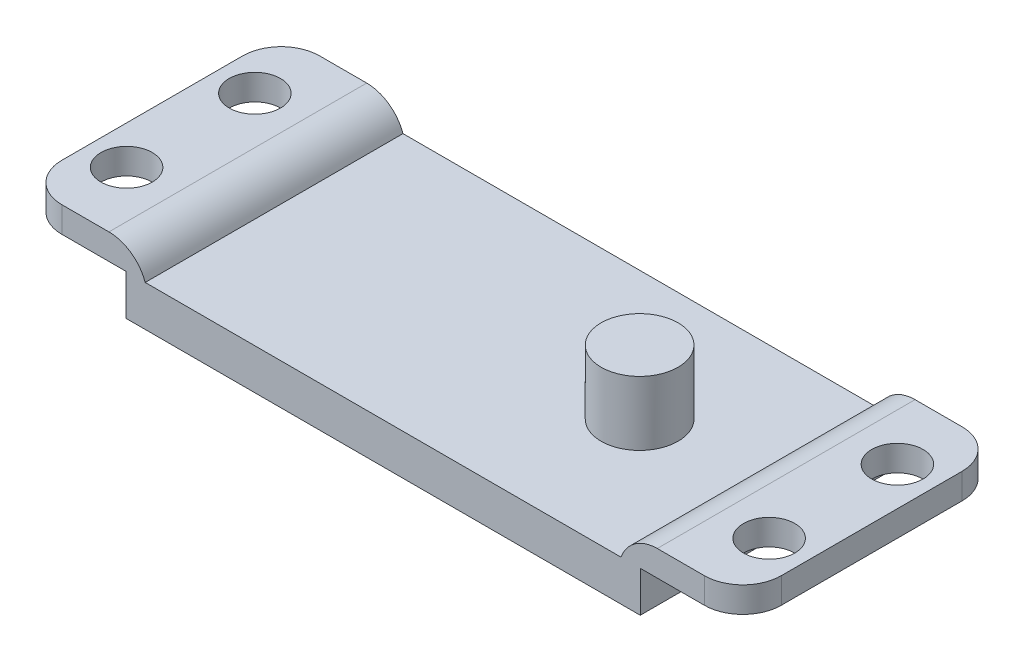
ISO-10303-21;
HEADER;
FILE_DESCRIPTION(('STEP AP214'),'2;1');
FILE_NAME('part.step','',(''),(''),'','','');
FILE_SCHEMA(('AUTOMOTIVE_DESIGN { 1 0 10303 214 1 1 1 1 }'));
ENDSEC;
DATA;
#1=APPLICATION_CONTEXT('core data for automotive mechanical design processes');
#2=APPLICATION_PROTOCOL_DEFINITION('international standard','automotive_design',2000,#1);
#3=PRODUCT_CONTEXT('',#1,'mechanical');
#4=PRODUCT('Part','Part','',(#3));
#5=PRODUCT_RELATED_PRODUCT_CATEGORY('part','',(#4));
#6=PRODUCT_DEFINITION_FORMATION('','',#4);
#7=PRODUCT_DEFINITION_CONTEXT('part definition',#1,'design');
#8=PRODUCT_DEFINITION('design','',#6,#7);
#9=PRODUCT_DEFINITION_SHAPE('','',#8);
#10=(LENGTH_UNIT() NAMED_UNIT(*) SI_UNIT(.MILLI.,.METRE.));
#11=(NAMED_UNIT(*) PLANE_ANGLE_UNIT() SI_UNIT($,.RADIAN.));
#12=(NAMED_UNIT(*) SI_UNIT($,.STERADIAN.) SOLID_ANGLE_UNIT());
#13=UNCERTAINTY_MEASURE_WITH_UNIT(LENGTH_MEASURE(1.E-05),#10,'distance_accuracy_value','');
#14=(GEOMETRIC_REPRESENTATION_CONTEXT(3) GLOBAL_UNCERTAINTY_ASSIGNED_CONTEXT((#13)) GLOBAL_UNIT_ASSIGNED_CONTEXT((#10,
#11,#12)) REPRESENTATION_CONTEXT('',''));
#15=CARTESIAN_POINT('',(0.,0.,0.));
#16=DIRECTION('',(0.,0.,1.));
#17=DIRECTION('',(1.,0.,0.));
#18=AXIS2_PLACEMENT_3D('',#15,#16,#17);
#19=CARTESIAN_POINT('',(20.05,3.175,10.05));
#20=DIRECTION('',(-1.,0.,0.));
#21=DIRECTION('',(0.,0.,1.));
#22=AXIS2_PLACEMENT_3D('',#19,#20,#21);
#23=PLANE('',#22);
#24=DIRECTION('',(0.,0.,-1.));
#25=VECTOR('',#24,1.);
#26=CARTESIAN_POINT('',(20.05,3.175,10.05));
#27=LINE('',#26,#25);
#28=CARTESIAN_POINT('',(20.05,3.175,10.05));
#29=VERTEX_POINT('',#28);
#30=CARTESIAN_POINT('',(20.05,3.175,-10.05));
#31=VERTEX_POINT('',#30);
#32=EDGE_CURVE('E191',#29,#31,#27,.T.);
#33=ORIENTED_EDGE('',*,*,#32,.F.);
#34=DIRECTION('',(0.,-1.,0.));
#35=VECTOR('',#34,1.);
#36=CARTESIAN_POINT('',(20.05,3.175,10.05));
#37=LINE('',#36,#35);
#38=CARTESIAN_POINT('',(20.05,0.,10.05));
#39=VERTEX_POINT('',#38);
#40=EDGE_CURVE('E174',#29,#39,#37,.T.);
#41=ORIENTED_EDGE('',*,*,#40,.T.);
#42=DIRECTION('',(0.,0.,-1.));
#43=VECTOR('',#42,1.);
#44=CARTESIAN_POINT('',(20.05,0.,10.05));
#45=LINE('',#44,#43);
#46=CARTESIAN_POINT('',(20.05,0.,-10.05));
#47=VERTEX_POINT('',#46);
#48=EDGE_CURVE('E293',#39,#47,#45,.T.);
#49=ORIENTED_EDGE('',*,*,#48,.T.);
#50=DIRECTION('',(0.,-1.,0.));
#51=VECTOR('',#50,1.);
#52=CARTESIAN_POINT('',(20.05,3.175,-10.05));
#53=LINE('',#52,#51);
#54=EDGE_CURVE('E176',#31,#47,#53,.T.);
#55=ORIENTED_EDGE('',*,*,#54,.F.);
#56=EDGE_LOOP('',(#33,#41,#49,#55));
#57=FACE_BOUND('',#56,.T.);
#58=ADVANCED_FACE('F33',(#57),#23,.F.);
#59=CARTESIAN_POINT('',(0.,3.175,0.));
#60=DIRECTION('',(0.,-1.,0.));
#61=DIRECTION('',(0.,0.,-1.));
#62=AXIS2_PLACEMENT_3D('',#59,#60,#61);
#63=PLANE('',#62);
#64=CARTESIAN_POINT('',(9.95,3.175,0.));
#65=DIRECTION('',(0.,-1.,0.));
#66=DIRECTION('',(0.,0.,-1.));
#67=AXIS2_PLACEMENT_3D('',#64,#65,#66);
#68=CIRCLE('',#67,3.);
#69=CARTESIAN_POINT('',(9.95,3.175,-3.));
#70=VERTEX_POINT('',#69);
#71=EDGE_CURVE('E11',#70,#70,#68,.F.);
#72=ORIENTED_EDGE('',*,*,#71,.F.);
#73=EDGE_LOOP('',(#72));
#74=FACE_BOUND('',#73,.T.);
#75=DIRECTION('',(-1.,0.,0.));
#76=VECTOR('',#75,1.);
#77=CARTESIAN_POINT('',(-20.05,3.175,-10.05));
#78=LINE('',#77,#76);
#79=CARTESIAN_POINT('',(18.55,3.175,-10.05));
#80=VERTEX_POINT('',#79);
#81=CARTESIAN_POINT('',(-18.55,3.175,-10.05));
#82=VERTEX_POINT('',#81);
#83=EDGE_CURVE('E296',#80,#82,#78,.T.);
#84=ORIENTED_EDGE('',*,*,#83,.T.);
#85=DIRECTION('',(0.,0.,1.));
#86=VECTOR('',#85,1.);
#87=CARTESIAN_POINT('',(-18.55,3.175,-10.05));
#88=LINE('',#87,#86);
#89=CARTESIAN_POINT('',(-18.55,3.175,10.05));
#90=VERTEX_POINT('',#89);
#91=EDGE_CURVE('E250',#82,#90,#88,.T.);
#92=ORIENTED_EDGE('',*,*,#91,.T.);
#93=DIRECTION('',(1.,0.,0.));
#94=VECTOR('',#93,1.);
#95=CARTESIAN_POINT('',(-20.05,3.175,10.05));
#96=LINE('',#95,#94);
#97=CARTESIAN_POINT('',(18.55,3.175,10.05));
#98=VERTEX_POINT('',#97);
#99=EDGE_CURVE('E178',#90,#98,#96,.T.);
#100=ORIENTED_EDGE('',*,*,#99,.T.);
#101=DIRECTION('',(0.,0.,1.));
#102=VECTOR('',#101,1.);
#103=CARTESIAN_POINT('',(18.55,3.175,-10.05));
#104=LINE('',#103,#102);
#105=EDGE_CURVE('E287',#80,#98,#104,.T.);
#106=ORIENTED_EDGE('',*,*,#105,.F.);
#107=EDGE_LOOP('',(#84,#92,#100,#106));
#108=FACE_BOUND('',#107,.T.);
#109=ADVANCED_FACE('F342',(#74,#108),#63,.F.);
#110=CARTESIAN_POINT('',(-20.05,3.175,-10.05));
#111=DIRECTION('',(0.,0.,1.));
#112=DIRECTION('',(1.,0.,0.));
#113=AXIS2_PLACEMENT_3D('',#110,#111,#112);
#114=PLANE('',#113);
#115=DIRECTION('',(1.,0.,0.));
#116=VECTOR('',#115,1.);
#117=CARTESIAN_POINT('',(-28.05,3.175,-10.05));
#118=LINE('',#117,#116);
#119=CARTESIAN_POINT('',(-25.05,3.175,-10.05));
#120=VERTEX_POINT('',#119);
#121=CARTESIAN_POINT('',(-20.05,3.175,-10.05));
#122=VERTEX_POINT('',#121);
#123=EDGE_CURVE('E157',#120,#122,#118,.T.);
#124=ORIENTED_EDGE('',*,*,#123,.F.);
#125=DIRECTION('',(0.,1.,0.));
#126=VECTOR('',#125,1.);
#127=CARTESIAN_POINT('',(-25.05,5.175,-10.05));
#128=LINE('',#127,#126);
#129=CARTESIAN_POINT('',(-25.05,5.175,-10.05));
#130=VERTEX_POINT('',#129);
#131=EDGE_CURVE('E231',#120,#130,#128,.T.);
#132=ORIENTED_EDGE('',*,*,#131,.T.);
#133=DIRECTION('',(1.,0.,0.));
#134=VECTOR('',#133,1.);
#135=CARTESIAN_POINT('',(-20.05,5.175,-10.05));
#136=LINE('',#135,#134);
#137=CARTESIAN_POINT('',(-21.3784271247462,5.175,-10.05));
#138=VERTEX_POINT('',#137);
#139=EDGE_CURVE('E257',#130,#138,#136,.T.);
#140=ORIENTED_EDGE('',*,*,#139,.T.);
#141=CARTESIAN_POINT('',(-21.3784271247462,2.175,-10.05));
#142=DIRECTION('',(0.,0.,1.));
#143=DIRECTION('',(1.,0.,0.));
#144=AXIS2_PLACEMENT_3D('',#141,#142,#143);
#145=CIRCLE('',#144,3.);
#146=EDGE_CURVE('E229',#138,#82,#145,.F.);
#147=ORIENTED_EDGE('',*,*,#146,.T.);
#148=ORIENTED_EDGE('',*,*,#83,.F.);
#149=CARTESIAN_POINT('',(21.3784271247462,2.175,-10.05));
#150=DIRECTION('',(0.,0.,1.));
#151=DIRECTION('',(1.,0.,0.));
#152=AXIS2_PLACEMENT_3D('',#149,#150,#151);
#153=CIRCLE('',#152,3.);
#154=CARTESIAN_POINT('',(21.3784271247462,5.175,-10.05));
#155=VERTEX_POINT('',#154);
#156=EDGE_CURVE('E197',#80,#155,#153,.F.);
#157=ORIENTED_EDGE('',*,*,#156,.T.);
#158=DIRECTION('',(-1.,0.,0.));
#159=VECTOR('',#158,1.);
#160=CARTESIAN_POINT('',(20.05,5.175,-10.05));
#161=LINE('',#160,#159);
#162=CARTESIAN_POINT('',(25.05,5.175,-10.05));
#163=VERTEX_POINT('',#162);
#164=EDGE_CURVE('E288',#163,#155,#161,.T.);
#165=ORIENTED_EDGE('',*,*,#164,.F.);
#166=DIRECTION('',(0.,1.,0.));
#167=VECTOR('',#166,1.);
#168=CARTESIAN_POINT('',(25.05,3.175,-10.05));
#169=LINE('',#168,#167);
#170=CARTESIAN_POINT('',(25.05,3.175,-10.05));
#171=VERTEX_POINT('',#170);
#172=EDGE_CURVE('E210',#163,#171,#169,.F.);
#173=ORIENTED_EDGE('',*,*,#172,.T.);
#174=DIRECTION('',(-1.,0.,0.));
#175=VECTOR('',#174,1.);
#176=CARTESIAN_POINT('',(28.05,3.175,-10.05));
#177=LINE('',#176,#175);
#178=EDGE_CURVE('E281',#171,#31,#177,.T.);
#179=ORIENTED_EDGE('',*,*,#178,.T.);
#180=ORIENTED_EDGE('',*,*,#54,.T.);
#181=DIRECTION('',(-1.,0.,0.));
#182=VECTOR('',#181,1.);
#183=CARTESIAN_POINT('',(-20.05,0.,-10.05));
#184=LINE('',#183,#182);
#185=CARTESIAN_POINT('',(-20.05,0.,-10.05));
#186=VERTEX_POINT('',#185);
#187=EDGE_CURVE('E303',#47,#186,#184,.T.);
#188=ORIENTED_EDGE('',*,*,#187,.T.);
#189=DIRECTION('',(0.,-1.,0.));
#190=VECTOR('',#189,1.);
#191=CARTESIAN_POINT('',(-20.05,3.175,-10.05));
#192=LINE('',#191,#190);
#193=EDGE_CURVE('E173',#122,#186,#192,.T.);
#194=ORIENTED_EDGE('',*,*,#193,.F.);
#195=EDGE_LOOP('',(#124,#132,#140,#147,#148,#157,#165,#173,#179,#180,#188,#194));
#196=FACE_BOUND('',#195,.T.);
#197=ADVANCED_FACE('F247',(#196),#114,.F.);
#198=CARTESIAN_POINT('',(-20.05,3.175,10.05));
#199=DIRECTION('',(1.,0.,0.));
#200=DIRECTION('',(0.,0.,-1.));
#201=AXIS2_PLACEMENT_3D('',#198,#199,#200);
#202=PLANE('',#201);
#203=DIRECTION('',(0.,-1.,0.));
#204=VECTOR('',#203,1.);
#205=CARTESIAN_POINT('',(-20.05,3.175,10.05));
#206=LINE('',#205,#204);
#207=CARTESIAN_POINT('',(-20.05,3.175,10.05));
#208=VERTEX_POINT('',#207);
#209=CARTESIAN_POINT('',(-20.05,0.,10.05));
#210=VERTEX_POINT('',#209);
#211=EDGE_CURVE('E154',#208,#210,#206,.T.);
#212=ORIENTED_EDGE('',*,*,#211,.F.);
#213=DIRECTION('',(0.,0.,-1.));
#214=VECTOR('',#213,1.);
#215=CARTESIAN_POINT('',(-20.05,3.175,10.05));
#216=LINE('',#215,#214);
#217=EDGE_CURVE('E161',#208,#122,#216,.T.);
#218=ORIENTED_EDGE('',*,*,#217,.T.);
#219=ORIENTED_EDGE('',*,*,#193,.T.);
#220=DIRECTION('',(0.,0.,1.));
#221=VECTOR('',#220,1.);
#222=CARTESIAN_POINT('',(-20.05,0.,10.05));
#223=LINE('',#222,#221);
#224=EDGE_CURVE('E171',#186,#210,#223,.T.);
#225=ORIENTED_EDGE('',*,*,#224,.T.);
#226=EDGE_LOOP('',(#212,#218,#219,#225));
#227=FACE_BOUND('',#226,.T.);
#228=ADVANCED_FACE('F169',(#227),#202,.F.);
#229=CARTESIAN_POINT('',(-20.05,3.175,10.05));
#230=DIRECTION('',(0.,0.,-1.));
#231=DIRECTION('',(-1.,0.,0.));
#232=AXIS2_PLACEMENT_3D('',#229,#230,#231);
#233=PLANE('',#232);
#234=DIRECTION('',(-1.,0.,0.));
#235=VECTOR('',#234,1.);
#236=CARTESIAN_POINT('',(-20.05,5.175,10.05));
#237=LINE('',#236,#235);
#238=CARTESIAN_POINT('',(-21.3784271247462,5.175,10.05));
#239=VERTEX_POINT('',#238);
#240=CARTESIAN_POINT('',(-25.05,5.175,10.05));
#241=VERTEX_POINT('',#240);
#242=EDGE_CURVE('E265',#239,#241,#237,.T.);
#243=ORIENTED_EDGE('',*,*,#242,.T.);
#244=DIRECTION('',(0.,-1.,0.));
#245=VECTOR('',#244,1.);
#246=CARTESIAN_POINT('',(-25.05,3.175,10.05));
#247=LINE('',#246,#245);
#248=CARTESIAN_POINT('',(-25.05,3.175,10.05));
#249=VERTEX_POINT('',#248);
#250=EDGE_CURVE('E41',#241,#249,#247,.T.);
#251=ORIENTED_EDGE('',*,*,#250,.T.);
#252=DIRECTION('',(1.,0.,0.));
#253=VECTOR('',#252,1.);
#254=CARTESIAN_POINT('',(-28.05,3.175,10.05));
#255=LINE('',#254,#253);
#256=EDGE_CURVE('E148',#249,#208,#255,.T.);
#257=ORIENTED_EDGE('',*,*,#256,.T.);
#258=ORIENTED_EDGE('',*,*,#211,.T.);
#259=DIRECTION('',(1.,0.,0.));
#260=VECTOR('',#259,1.);
#261=CARTESIAN_POINT('',(-20.05,0.,10.05));
#262=LINE('',#261,#260);
#263=EDGE_CURVE('E299',#210,#39,#262,.T.);
#264=ORIENTED_EDGE('',*,*,#263,.T.);
#265=ORIENTED_EDGE('',*,*,#40,.F.);
#266=DIRECTION('',(-1.,0.,0.));
#267=VECTOR('',#266,1.);
#268=CARTESIAN_POINT('',(28.05,3.175,10.05));
#269=LINE('',#268,#267);
#270=CARTESIAN_POINT('',(25.05,3.175,10.05));
#271=VERTEX_POINT('',#270);
#272=EDGE_CURVE('E285',#271,#29,#269,.T.);
#273=ORIENTED_EDGE('',*,*,#272,.F.);
#274=DIRECTION('',(0.,-1.,0.));
#275=VECTOR('',#274,1.);
#276=CARTESIAN_POINT('',(25.05,5.175,10.05));
#277=LINE('',#276,#275);
#278=CARTESIAN_POINT('',(25.05,5.175,10.05));
#279=VERTEX_POINT('',#278);
#280=EDGE_CURVE('E216',#271,#279,#277,.F.);
#281=ORIENTED_EDGE('',*,*,#280,.T.);
#282=DIRECTION('',(1.,0.,0.));
#283=VECTOR('',#282,1.);
#284=CARTESIAN_POINT('',(20.05,5.175,10.05));
#285=LINE('',#284,#283);
#286=CARTESIAN_POINT('',(21.3784271247462,5.175,10.05));
#287=VERTEX_POINT('',#286);
#288=EDGE_CURVE('E290',#287,#279,#285,.T.);
#289=ORIENTED_EDGE('',*,*,#288,.F.);
#290=CARTESIAN_POINT('',(21.3784271247462,2.175,10.05));
#291=DIRECTION('',(0.,0.,-1.));
#292=DIRECTION('',(-1.,0.,0.));
#293=AXIS2_PLACEMENT_3D('',#290,#291,#292);
#294=CIRCLE('',#293,3.);
#295=EDGE_CURVE('E194',#287,#98,#294,.F.);
#296=ORIENTED_EDGE('',*,*,#295,.T.);
#297=ORIENTED_EDGE('',*,*,#99,.F.);
#298=CARTESIAN_POINT('',(-21.3784271247462,2.175,10.05));
#299=DIRECTION('',(0.,0.,-1.));
#300=DIRECTION('',(-1.,0.,0.));
#301=AXIS2_PLACEMENT_3D('',#298,#299,#300);
#302=CIRCLE('',#301,3.);
#303=EDGE_CURVE('E218',#90,#239,#302,.F.);
#304=ORIENTED_EDGE('',*,*,#303,.T.);
#305=EDGE_LOOP('',(#243,#251,#257,#258,#264,#265,#273,#281,#289,#296,#297,#304));
#306=FACE_BOUND('',#305,.T.);
#307=ADVANCED_FACE('F151',(#306),#233,.F.);
#308=CARTESIAN_POINT('',(0.,0.,0.));
#309=DIRECTION('',(0.,-1.,0.));
#310=DIRECTION('',(0.,0.,-1.));
#311=AXIS2_PLACEMENT_3D('',#308,#309,#310);
#312=PLANE('',#311);
#313=ORIENTED_EDGE('',*,*,#48,.F.);
#314=ORIENTED_EDGE('',*,*,#263,.F.);
#315=ORIENTED_EDGE('',*,*,#224,.F.);
#316=ORIENTED_EDGE('',*,*,#187,.F.);
#317=EDGE_LOOP('',(#313,#314,#315,#316));
#318=FACE_BOUND('',#317,.T.);
#319=ADVANCED_FACE('F310',(#318),#312,.T.);
#320=CARTESIAN_POINT('',(0.,5.175,0.));
#321=DIRECTION('',(0.,-1.,0.));
#322=DIRECTION('',(0.,0.,-1.));
#323=AXIS2_PLACEMENT_3D('',#320,#321,#322);
#324=PLANE('',#323);
#325=CARTESIAN_POINT('',(25.05,5.175,5.));
#326=DIRECTION('',(0.,-1.,0.));
#327=DIRECTION('',(0.,0.,-1.));
#328=AXIS2_PLACEMENT_3D('',#325,#326,#327);
#329=CIRCLE('',#328,2.);
#330=CARTESIAN_POINT('',(25.05,5.175,3.));
#331=VERTEX_POINT('',#330);
#332=EDGE_CURVE('E188',#331,#331,#329,.T.);
#333=ORIENTED_EDGE('',*,*,#332,.T.);
#334=EDGE_LOOP('',(#333));
#335=FACE_BOUND('',#334,.T.);
#336=CARTESIAN_POINT('',(25.05,5.175,-5.));
#337=DIRECTION('',(0.,-1.,0.));
#338=DIRECTION('',(0.,0.,-1.));
#339=AXIS2_PLACEMENT_3D('',#336,#337,#338);
#340=CIRCLE('',#339,2.);
#341=CARTESIAN_POINT('',(25.05,5.175,-7.));
#342=VERTEX_POINT('',#341);
#343=EDGE_CURVE('E268',#342,#342,#340,.T.);
#344=ORIENTED_EDGE('',*,*,#343,.T.);
#345=EDGE_LOOP('',(#344));
#346=FACE_BOUND('',#345,.T.);
#347=DIRECTION('',(0.,0.,1.));
#348=VECTOR('',#347,1.);
#349=CARTESIAN_POINT('',(28.05,5.175,10.05));
#350=LINE('',#349,#348);
#351=CARTESIAN_POINT('',(28.05,5.175,-7.05));
#352=VERTEX_POINT('',#351);
#353=CARTESIAN_POINT('',(28.05,5.175,7.05));
#354=VERTEX_POINT('',#353);
#355=EDGE_CURVE('E278',#352,#354,#350,.T.);
#356=ORIENTED_EDGE('',*,*,#355,.F.);
#357=CARTESIAN_POINT('',(25.05,5.175,-7.05));
#358=DIRECTION('',(0.,-1.,0.));
#359=DIRECTION('',(0.,0.,-1.));
#360=AXIS2_PLACEMENT_3D('',#357,#358,#359);
#361=CIRCLE('',#360,3.);
#362=EDGE_CURVE('E208',#352,#163,#361,.F.);
#363=ORIENTED_EDGE('',*,*,#362,.T.);
#364=ORIENTED_EDGE('',*,*,#164,.T.);
#365=DIRECTION('',(0.,0.,-1.));
#366=VECTOR('',#365,1.);
#367=CARTESIAN_POINT('',(21.3784271247462,5.175,0.));
#368=LINE('',#367,#366);
#369=EDGE_CURVE('E183',#155,#287,#368,.F.);
#370=ORIENTED_EDGE('',*,*,#369,.T.);
#371=ORIENTED_EDGE('',*,*,#288,.T.);
#372=CARTESIAN_POINT('',(25.05,5.175,7.05));
#373=DIRECTION('',(0.,-1.,0.));
#374=DIRECTION('',(0.,0.,-1.));
#375=AXIS2_PLACEMENT_3D('',#372,#373,#374);
#376=CIRCLE('',#375,3.);
#377=EDGE_CURVE('E206',#279,#354,#376,.F.);
#378=ORIENTED_EDGE('',*,*,#377,.T.);
#379=EDGE_LOOP('',(#356,#363,#364,#370,#371,#378));
#380=FACE_BOUND('',#379,.T.);
#381=ADVANCED_FACE('F327',(#335,#346,#380),#324,.F.);
#382=CARTESIAN_POINT('',(28.05,3.175,10.05));
#383=DIRECTION('',(0.,1.,0.));
#384=DIRECTION('',(0.,0.,1.));
#385=AXIS2_PLACEMENT_3D('',#382,#383,#384);
#386=PLANE('',#385);
#387=CARTESIAN_POINT('',(25.05,3.175,5.));
#388=DIRECTION('',(0.,1.,0.));
#389=DIRECTION('',(0.,0.,1.));
#390=AXIS2_PLACEMENT_3D('',#387,#388,#389);
#391=CIRCLE('',#390,2.);
#392=CARTESIAN_POINT('',(25.05,3.175,7.));
#393=VERTEX_POINT('',#392);
#394=EDGE_CURVE('E187',#393,#393,#391,.T.);
#395=ORIENTED_EDGE('',*,*,#394,.T.);
#396=EDGE_LOOP('',(#395));
#397=FACE_BOUND('',#396,.T.);
#398=CARTESIAN_POINT('',(25.05,3.175,-5.));
#399=DIRECTION('',(0.,1.,0.));
#400=DIRECTION('',(0.,0.,1.));
#401=AXIS2_PLACEMENT_3D('',#398,#399,#400);
#402=CIRCLE('',#401,2.);
#403=CARTESIAN_POINT('',(25.05,3.175,-3.));
#404=VERTEX_POINT('',#403);
#405=EDGE_CURVE('E184',#404,#404,#402,.T.);
#406=ORIENTED_EDGE('',*,*,#405,.T.);
#407=EDGE_LOOP('',(#406));
#408=FACE_BOUND('',#407,.T.);
#409=ORIENTED_EDGE('',*,*,#178,.F.);
#410=CARTESIAN_POINT('',(25.05,3.175,-7.05));
#411=DIRECTION('',(0.,1.,0.));
#412=DIRECTION('',(0.,0.,1.));
#413=AXIS2_PLACEMENT_3D('',#410,#411,#412);
#414=CIRCLE('',#413,3.);
#415=CARTESIAN_POINT('',(28.05,3.175,-7.05));
#416=VERTEX_POINT('',#415);
#417=EDGE_CURVE('E214',#171,#416,#414,.F.);
#418=ORIENTED_EDGE('',*,*,#417,.T.);
#419=DIRECTION('',(0.,0.,-1.));
#420=VECTOR('',#419,1.);
#421=CARTESIAN_POINT('',(28.05,3.175,10.05));
#422=LINE('',#421,#420);
#423=CARTESIAN_POINT('',(28.05,3.175,7.05));
#424=VERTEX_POINT('',#423);
#425=EDGE_CURVE('E275',#424,#416,#422,.T.);
#426=ORIENTED_EDGE('',*,*,#425,.F.);
#427=CARTESIAN_POINT('',(25.05,3.175,7.05));
#428=DIRECTION('',(0.,1.,0.));
#429=DIRECTION('',(0.,0.,1.));
#430=AXIS2_PLACEMENT_3D('',#427,#428,#429);
#431=CIRCLE('',#430,3.);
#432=EDGE_CURVE('E212',#424,#271,#431,.F.);
#433=ORIENTED_EDGE('',*,*,#432,.T.);
#434=ORIENTED_EDGE('',*,*,#272,.T.);
#435=ORIENTED_EDGE('',*,*,#32,.T.);
#436=EDGE_LOOP('',(#409,#418,#426,#433,#434,#435));
#437=FACE_BOUND('',#436,.T.);
#438=ADVANCED_FACE('F316',(#397,#408,#437),#386,.F.);
#439=CARTESIAN_POINT('',(28.05,0.,0.));
#440=DIRECTION('',(1.,0.,0.));
#441=DIRECTION('',(0.,0.,-1.));
#442=AXIS2_PLACEMENT_3D('',#439,#440,#441);
#443=PLANE('',#442);
#444=ORIENTED_EDGE('',*,*,#425,.T.);
#445=DIRECTION('',(0.,1.,0.));
#446=VECTOR('',#445,1.);
#447=CARTESIAN_POINT('',(28.05,5.175,-7.05));
#448=LINE('',#447,#446);
#449=EDGE_CURVE('E203',#416,#352,#448,.T.);
#450=ORIENTED_EDGE('',*,*,#449,.T.);
#451=ORIENTED_EDGE('',*,*,#355,.T.);
#452=DIRECTION('',(0.,-1.,0.));
#453=VECTOR('',#452,1.);
#454=CARTESIAN_POINT('',(28.05,3.175,7.05));
#455=LINE('',#454,#453);
#456=EDGE_CURVE('E200',#354,#424,#455,.T.);
#457=ORIENTED_EDGE('',*,*,#456,.T.);
#458=EDGE_LOOP('',(#444,#450,#451,#457));
#459=FACE_BOUND('',#458,.T.);
#460=ADVANCED_FACE('F329',(#459),#443,.T.);
#461=CARTESIAN_POINT('',(25.05,5.175,-5.));
#462=DIRECTION('',(0.,-1.,0.));
#463=DIRECTION('',(0.,0.,-1.));
#464=AXIS2_PLACEMENT_3D('',#461,#462,#463);
#465=CYLINDRICAL_SURFACE('',#464,2.);
#466=ORIENTED_EDGE('',*,*,#343,.F.);
#467=EDGE_LOOP('',(#466));
#468=FACE_BOUND('',#467,.T.);
#469=ORIENTED_EDGE('',*,*,#405,.F.);
#470=EDGE_LOOP('',(#469));
#471=FACE_BOUND('',#470,.T.);
#472=ADVANCED_FACE('F402',(#468,#471),#465,.F.);
#473=CARTESIAN_POINT('',(25.05,5.175,5.));
#474=DIRECTION('',(0.,-1.,0.));
#475=DIRECTION('',(0.,0.,-1.));
#476=AXIS2_PLACEMENT_3D('',#473,#474,#475);
#477=CYLINDRICAL_SURFACE('',#476,2.);
#478=ORIENTED_EDGE('',*,*,#332,.F.);
#479=EDGE_LOOP('',(#478));
#480=FACE_BOUND('',#479,.T.);
#481=ORIENTED_EDGE('',*,*,#394,.F.);
#482=EDGE_LOOP('',(#481));
#483=FACE_BOUND('',#482,.T.);
#484=ADVANCED_FACE('F370',(#480,#483),#477,.F.);
#485=CARTESIAN_POINT('',(21.3784271247462,2.175,-10.05));
#486=DIRECTION('',(0.,0.,-1.));
#487=DIRECTION('',(-1.,0.,0.));
#488=AXIS2_PLACEMENT_3D('',#485,#486,#487);
#489=CYLINDRICAL_SURFACE('',#488,3.);
#490=ORIENTED_EDGE('',*,*,#156,.F.);
#491=ORIENTED_EDGE('',*,*,#105,.T.);
#492=ORIENTED_EDGE('',*,*,#295,.F.);
#493=ORIENTED_EDGE('',*,*,#369,.F.);
#494=EDGE_LOOP('',(#490,#491,#492,#493));
#495=FACE_BOUND('',#494,.T.);
#496=ADVANCED_FACE('F339',(#495),#489,.T.);
#497=CARTESIAN_POINT('',(25.05,0.,-7.05));
#498=DIRECTION('',(0.,-1.,0.));
#499=DIRECTION('',(0.,0.,-1.));
#500=AXIS2_PLACEMENT_3D('',#497,#498,#499);
#501=CYLINDRICAL_SURFACE('',#500,3.);
#502=ORIENTED_EDGE('',*,*,#417,.F.);
#503=ORIENTED_EDGE('',*,*,#172,.F.);
#504=ORIENTED_EDGE('',*,*,#362,.F.);
#505=ORIENTED_EDGE('',*,*,#449,.F.);
#506=EDGE_LOOP('',(#502,#503,#504,#505));
#507=FACE_BOUND('',#506,.T.);
#508=ADVANCED_FACE('F332',(#507),#501,.T.);
#509=CARTESIAN_POINT('',(25.05,0.,7.05));
#510=DIRECTION('',(0.,1.,0.));
#511=DIRECTION('',(0.,0.,1.));
#512=AXIS2_PLACEMENT_3D('',#509,#510,#511);
#513=CYLINDRICAL_SURFACE('',#512,3.);
#514=ORIENTED_EDGE('',*,*,#377,.F.);
#515=ORIENTED_EDGE('',*,*,#280,.F.);
#516=ORIENTED_EDGE('',*,*,#432,.F.);
#517=ORIENTED_EDGE('',*,*,#456,.F.);
#518=EDGE_LOOP('',(#514,#515,#516,#517));
#519=FACE_BOUND('',#518,.T.);
#520=ADVANCED_FACE('F323',(#519),#513,.T.);
#521=CARTESIAN_POINT('',(0.,5.175,0.));
#522=DIRECTION('',(0.,-1.,0.));
#523=DIRECTION('',(0.,0.,-1.));
#524=AXIS2_PLACEMENT_3D('',#521,#522,#523);
#525=PLANE('',#524);
#526=CARTESIAN_POINT('',(-25.05,5.175,5.));
#527=DIRECTION('',(0.,1.,0.));
#528=DIRECTION('',(0.,0.,-1.));
#529=AXIS2_PLACEMENT_3D('',#526,#527,#528);
#530=CIRCLE('',#529,2.);
#531=CARTESIAN_POINT('',(-25.05,5.175,3.));
#532=VERTEX_POINT('',#531);
#533=EDGE_CURVE('E222',#532,#532,#530,.T.);
#534=ORIENTED_EDGE('',*,*,#533,.F.);
#535=EDGE_LOOP('',(#534));
#536=FACE_BOUND('',#535,.T.);
#537=CARTESIAN_POINT('',(-25.05,5.175,-5.));
#538=DIRECTION('',(0.,1.,0.));
#539=DIRECTION('',(0.,0.,-1.));
#540=AXIS2_PLACEMENT_3D('',#537,#538,#539);
#541=CIRCLE('',#540,2.);
#542=CARTESIAN_POINT('',(-25.05,5.175,-7.));
#543=VERTEX_POINT('',#542);
#544=EDGE_CURVE('E262',#543,#543,#541,.T.);
#545=ORIENTED_EDGE('',*,*,#544,.F.);
#546=EDGE_LOOP('',(#545));
#547=FACE_BOUND('',#546,.T.);
#548=ORIENTED_EDGE('',*,*,#139,.F.);
#549=CARTESIAN_POINT('',(-25.05,5.175,-7.05));
#550=DIRECTION('',(0.,-1.,0.));
#551=DIRECTION('',(0.,0.,-1.));
#552=AXIS2_PLACEMENT_3D('',#549,#550,#551);
#553=CIRCLE('',#552,3.);
#554=CARTESIAN_POINT('',(-28.05,5.175,-7.05));
#555=VERTEX_POINT('',#554);
#556=EDGE_CURVE('E236',#130,#555,#553,.F.);
#557=ORIENTED_EDGE('',*,*,#556,.T.);
#558=DIRECTION('',(0.,0.,1.));
#559=VECTOR('',#558,1.);
#560=CARTESIAN_POINT('',(-28.05,5.175,10.05));
#561=LINE('',#560,#559);
#562=CARTESIAN_POINT('',(-28.05,5.175,7.05));
#563=VERTEX_POINT('',#562);
#564=EDGE_CURVE('E166',#555,#563,#561,.T.);
#565=ORIENTED_EDGE('',*,*,#564,.T.);
#566=CARTESIAN_POINT('',(-25.05,5.175,7.05));
#567=DIRECTION('',(0.,-1.,0.));
#568=DIRECTION('',(0.,0.,-1.));
#569=AXIS2_PLACEMENT_3D('',#566,#567,#568);
#570=CIRCLE('',#569,3.);
#571=EDGE_CURVE('E234',#563,#241,#570,.F.);
#572=ORIENTED_EDGE('',*,*,#571,.T.);
#573=ORIENTED_EDGE('',*,*,#242,.F.);
#574=DIRECTION('',(0.,0.,-1.));
#575=VECTOR('',#574,1.);
#576=CARTESIAN_POINT('',(-21.3784271247462,5.175,0.));
#577=LINE('',#576,#575);
#578=EDGE_CURVE('E226',#239,#138,#577,.T.);
#579=ORIENTED_EDGE('',*,*,#578,.T.);
#580=EDGE_LOOP('',(#548,#557,#565,#572,#573,#579));
#581=FACE_BOUND('',#580,.T.);
#582=ADVANCED_FACE('F255',(#536,#547,#581),#525,.F.);
#583=CARTESIAN_POINT('',(-28.05,3.175,10.05));
#584=DIRECTION('',(0.,-1.,0.));
#585=DIRECTION('',(0.,0.,-1.));
#586=AXIS2_PLACEMENT_3D('',#583,#584,#585);
#587=PLANE('',#586);
#588=CARTESIAN_POINT('',(-25.05,3.175,5.));
#589=DIRECTION('',(0.,-1.,0.));
#590=DIRECTION('',(0.,0.,-1.));
#591=AXIS2_PLACEMENT_3D('',#588,#589,#590);
#592=CIRCLE('',#591,2.);
#593=CARTESIAN_POINT('',(-25.05,3.175,3.));
#594=VERTEX_POINT('',#593);
#595=EDGE_CURVE('E167',#594,#594,#592,.F.);
#596=ORIENTED_EDGE('',*,*,#595,.T.);
#597=EDGE_LOOP('',(#596));
#598=FACE_BOUND('',#597,.T.);
#599=CARTESIAN_POINT('',(-25.05,3.175,-5.));
#600=DIRECTION('',(0.,-1.,0.));
#601=DIRECTION('',(0.,0.,-1.));
#602=AXIS2_PLACEMENT_3D('',#599,#600,#601);
#603=CIRCLE('',#602,2.);
#604=CARTESIAN_POINT('',(-25.05,3.175,-7.));
#605=VERTEX_POINT('',#604);
#606=EDGE_CURVE('E219',#605,#605,#603,.F.);
#607=ORIENTED_EDGE('',*,*,#606,.T.);
#608=EDGE_LOOP('',(#607));
#609=FACE_BOUND('',#608,.T.);
#610=DIRECTION('',(0.,0.,-1.));
#611=VECTOR('',#610,1.);
#612=CARTESIAN_POINT('',(-28.05,3.175,10.05));
#613=LINE('',#612,#611);
#614=CARTESIAN_POINT('',(-28.05,3.175,7.05));
#615=VERTEX_POINT('',#614);
#616=CARTESIAN_POINT('',(-28.05,3.175,-7.05));
#617=VERTEX_POINT('',#616);
#618=EDGE_CURVE('E158',#615,#617,#613,.T.);
#619=ORIENTED_EDGE('',*,*,#618,.T.);
#620=CARTESIAN_POINT('',(-25.05,3.175,-7.05));
#621=DIRECTION('',(0.,-1.,0.));
#622=DIRECTION('',(0.,0.,-1.));
#623=AXIS2_PLACEMENT_3D('',#620,#621,#622);
#624=CIRCLE('',#623,3.);
#625=EDGE_CURVE('E242',#617,#120,#624,.T.);
#626=ORIENTED_EDGE('',*,*,#625,.T.);
#627=ORIENTED_EDGE('',*,*,#123,.T.);
#628=ORIENTED_EDGE('',*,*,#217,.F.);
#629=ORIENTED_EDGE('',*,*,#256,.F.);
#630=CARTESIAN_POINT('',(-25.05,3.175,7.05));
#631=DIRECTION('',(0.,-1.,0.));
#632=DIRECTION('',(0.,0.,-1.));
#633=AXIS2_PLACEMENT_3D('',#630,#631,#632);
#634=CIRCLE('',#633,3.);
#635=EDGE_CURVE('E48',#249,#615,#634,.T.);
#636=ORIENTED_EDGE('',*,*,#635,.T.);
#637=EDGE_LOOP('',(#619,#626,#627,#628,#629,#636));
#638=FACE_BOUND('',#637,.T.);
#639=ADVANCED_FACE('F162',(#598,#609,#638),#587,.T.);
#640=CARTESIAN_POINT('',(-28.05,0.,0.));
#641=DIRECTION('',(-1.,0.,0.));
#642=DIRECTION('',(0.,0.,-1.));
#643=AXIS2_PLACEMENT_3D('',#640,#641,#642);
#644=PLANE('',#643);
#645=ORIENTED_EDGE('',*,*,#564,.F.);
#646=DIRECTION('',(0.,1.,0.));
#647=VECTOR('',#646,1.);
#648=CARTESIAN_POINT('',(-28.05,3.175,-7.05));
#649=LINE('',#648,#647);
#650=EDGE_CURVE('E56',#555,#617,#649,.F.);
#651=ORIENTED_EDGE('',*,*,#650,.T.);
#652=ORIENTED_EDGE('',*,*,#618,.F.);
#653=DIRECTION('',(0.,-1.,0.));
#654=VECTOR('',#653,1.);
#655=CARTESIAN_POINT('',(-28.05,5.175,7.05));
#656=LINE('',#655,#654);
#657=EDGE_CURVE('E238',#615,#563,#656,.F.);
#658=ORIENTED_EDGE('',*,*,#657,.T.);
#659=EDGE_LOOP('',(#645,#651,#652,#658));
#660=FACE_BOUND('',#659,.T.);
#661=ADVANCED_FACE('F258',(#660),#644,.T.);
#662=CARTESIAN_POINT('',(-25.05,5.175,-5.));
#663=DIRECTION('',(0.,-1.,0.));
#664=DIRECTION('',(0.,0.,-1.));
#665=AXIS2_PLACEMENT_3D('',#662,#663,#664);
#666=CYLINDRICAL_SURFACE('',#665,2.);
#667=ORIENTED_EDGE('',*,*,#606,.F.);
#668=EDGE_LOOP('',(#667));
#669=FACE_BOUND('',#668,.T.);
#670=ORIENTED_EDGE('',*,*,#544,.T.);
#671=EDGE_LOOP('',(#670));
#672=FACE_BOUND('',#671,.T.);
#673=ADVANCED_FACE('F380',(#669,#672),#666,.F.);
#674=CARTESIAN_POINT('',(-25.05,5.175,5.));
#675=DIRECTION('',(0.,-1.,0.));
#676=DIRECTION('',(0.,0.,-1.));
#677=AXIS2_PLACEMENT_3D('',#674,#675,#676);
#678=CYLINDRICAL_SURFACE('',#677,2.);
#679=ORIENTED_EDGE('',*,*,#595,.F.);
#680=EDGE_LOOP('',(#679));
#681=FACE_BOUND('',#680,.T.);
#682=ORIENTED_EDGE('',*,*,#533,.T.);
#683=EDGE_LOOP('',(#682));
#684=FACE_BOUND('',#683,.T.);
#685=ADVANCED_FACE('F376',(#681,#684),#678,.F.);
#686=CARTESIAN_POINT('',(-21.3784271247462,2.175,-10.05));
#687=DIRECTION('',(0.,0.,-1.));
#688=DIRECTION('',(-1.,0.,0.));
#689=AXIS2_PLACEMENT_3D('',#686,#687,#688);
#690=CYLINDRICAL_SURFACE('',#689,3.);
#691=ORIENTED_EDGE('',*,*,#146,.F.);
#692=ORIENTED_EDGE('',*,*,#578,.F.);
#693=ORIENTED_EDGE('',*,*,#303,.F.);
#694=ORIENTED_EDGE('',*,*,#91,.F.);
#695=EDGE_LOOP('',(#691,#692,#693,#694));
#696=FACE_BOUND('',#695,.T.);
#697=ADVANCED_FACE('F346',(#696),#690,.T.);
#698=CARTESIAN_POINT('',(-25.05,3.175,-7.05));
#699=DIRECTION('',(0.,-1.,0.));
#700=DIRECTION('',(0.,0.,-1.));
#701=AXIS2_PLACEMENT_3D('',#698,#699,#700);
#702=CYLINDRICAL_SURFACE('',#701,3.);
#703=ORIENTED_EDGE('',*,*,#625,.F.);
#704=ORIENTED_EDGE('',*,*,#650,.F.);
#705=ORIENTED_EDGE('',*,*,#556,.F.);
#706=ORIENTED_EDGE('',*,*,#131,.F.);
#707=EDGE_LOOP('',(#703,#704,#705,#706));
#708=FACE_BOUND('',#707,.T.);
#709=ADVANCED_FACE('F252',(#708),#702,.T.);
#710=CARTESIAN_POINT('',(-25.05,3.175,7.05));
#711=DIRECTION('',(0.,1.,0.));
#712=DIRECTION('',(0.,0.,1.));
#713=AXIS2_PLACEMENT_3D('',#710,#711,#712);
#714=CYLINDRICAL_SURFACE('',#713,3.);
#715=ORIENTED_EDGE('',*,*,#571,.F.);
#716=ORIENTED_EDGE('',*,*,#657,.F.);
#717=ORIENTED_EDGE('',*,*,#635,.F.);
#718=ORIENTED_EDGE('',*,*,#250,.F.);
#719=EDGE_LOOP('',(#715,#716,#717,#718));
#720=FACE_BOUND('',#719,.T.);
#721=ADVANCED_FACE('F35',(#720),#714,.T.);
#722=CARTESIAN_POINT('',(9.95,8.175,0.));
#723=DIRECTION('',(0.,-1.,0.));
#724=DIRECTION('',(0.,0.,-1.));
#725=AXIS2_PLACEMENT_3D('',#722,#723,#724);
#726=CYLINDRICAL_SURFACE('',#725,3.);
#727=CARTESIAN_POINT('',(9.95,8.175,0.));
#728=DIRECTION('',(0.,1.,0.));
#729=DIRECTION('',(0.,0.,1.));
#730=AXIS2_PLACEMENT_3D('',#727,#728,#729);
#731=CIRCLE('',#730,3.);
#732=CARTESIAN_POINT('',(9.95,8.175,3.));
#733=VERTEX_POINT('',#732);
#734=EDGE_CURVE('E454',#733,#733,#731,.T.);
#735=ORIENTED_EDGE('',*,*,#734,.F.);
#736=EDGE_LOOP('',(#735));
#737=FACE_BOUND('',#736,.T.);
#738=ORIENTED_EDGE('',*,*,#71,.T.);
#739=EDGE_LOOP('',(#738));
#740=FACE_BOUND('',#739,.T.);
#741=ADVANCED_FACE('F350',(#737,#740),#726,.T.);
#742=CARTESIAN_POINT('',(9.95,8.175,0.));
#743=DIRECTION('',(0.,1.,0.));
#744=DIRECTION('',(0.,0.,1.));
#745=AXIS2_PLACEMENT_3D('',#742,#743,#744);
#746=PLANE('',#745);
#747=ORIENTED_EDGE('',*,*,#734,.T.);
#748=EDGE_LOOP('',(#747));
#749=FACE_BOUND('',#748,.T.);
#750=ADVANCED_FACE('F355',(#749),#746,.T.);
#751=CLOSED_SHELL('',(#58,#109,#197,#228,#307,#319,#381,#438,#460,#472,#484,#496,#508,#520,#582,
#639,#661,#673,#685,#697,#709,#721,#741,#750));
#752=MANIFOLD_SOLID_BREP('B2',#751);
#753=ADVANCED_BREP_SHAPE_REPRESENTATION('',(#18,#752),#14);
#754=SHAPE_DEFINITION_REPRESENTATION(#9,#753);
ENDSEC;
END-ISO-10303-21;
